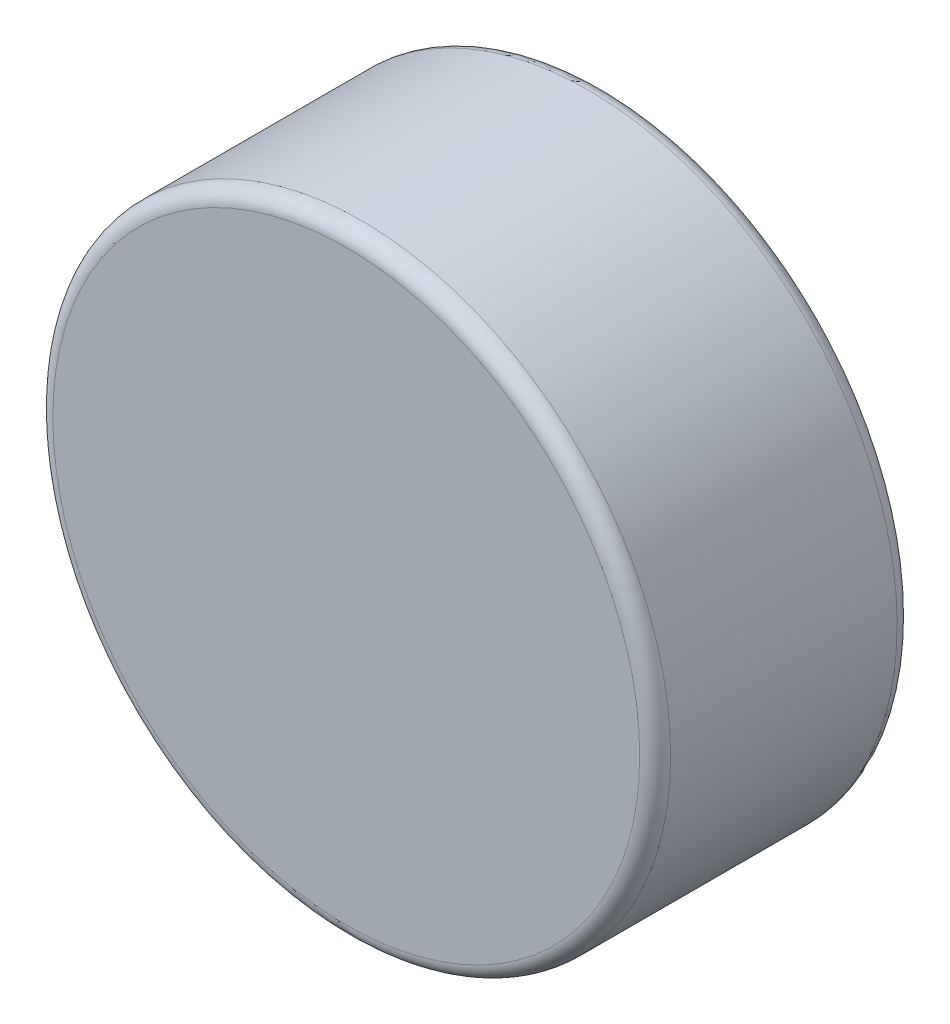
ISO-10303-21;
HEADER;
FILE_DESCRIPTION(('STEP AP214'),'2;1');
FILE_NAME('part.step','',(''),(''),'','','');
FILE_SCHEMA(('AUTOMOTIVE_DESIGN { 1 0 10303 214 1 1 1 1 }'));
ENDSEC;
DATA;
#1=APPLICATION_CONTEXT('core data for automotive mechanical design processes');
#2=APPLICATION_PROTOCOL_DEFINITION('international standard','automotive_design',2000,#1);
#3=PRODUCT_CONTEXT('',#1,'mechanical');
#4=PRODUCT('Part','Part','',(#3));
#5=PRODUCT_RELATED_PRODUCT_CATEGORY('part','',(#4));
#6=PRODUCT_DEFINITION_FORMATION('','',#4);
#7=PRODUCT_DEFINITION_CONTEXT('part definition',#1,'design');
#8=PRODUCT_DEFINITION('design','',#6,#7);
#9=PRODUCT_DEFINITION_SHAPE('','',#8);
#10=(LENGTH_UNIT() NAMED_UNIT(*) SI_UNIT(.MILLI.,.METRE.));
#11=(NAMED_UNIT(*) PLANE_ANGLE_UNIT() SI_UNIT($,.RADIAN.));
#12=(NAMED_UNIT(*) SI_UNIT($,.STERADIAN.) SOLID_ANGLE_UNIT());
#13=UNCERTAINTY_MEASURE_WITH_UNIT(LENGTH_MEASURE(1.E-05),#10,'distance_accuracy_value','');
#14=(GEOMETRIC_REPRESENTATION_CONTEXT(3) GLOBAL_UNCERTAINTY_ASSIGNED_CONTEXT((#13)) GLOBAL_UNIT_ASSIGNED_CONTEXT((#10,
#11,#12)) REPRESENTATION_CONTEXT('',''));
#15=CARTESIAN_POINT('',(0.,0.,0.));
#16=DIRECTION('',(0.,0.,1.));
#17=DIRECTION('',(1.,0.,0.));
#18=AXIS2_PLACEMENT_3D('',#15,#16,#17);
#19=CARTESIAN_POINT('',(0.,0.,2.5));
#20=DIRECTION('',(0.,0.,-1.));
#21=DIRECTION('',(-1.,0.,0.));
#22=AXIS2_PLACEMENT_3D('',#19,#20,#21);
#23=CYLINDRICAL_SURFACE('',#22,3.);
#24=CARTESIAN_POINT('',(0.,0.,0.15));
#25=DIRECTION('',(0.,0.,1.));
#26=DIRECTION('',(1.,0.,0.));
#27=AXIS2_PLACEMENT_3D('',#24,#25,#26);
#28=CIRCLE('',#27,3.);
#29=CARTESIAN_POINT('',(3.,0.,0.15));
#30=VERTEX_POINT('',#29);
#31=EDGE_CURVE('E43',#30,#30,#28,.T.);
#32=ORIENTED_EDGE('',*,*,#31,.T.);
#33=EDGE_LOOP('',(#32));
#34=FACE_BOUND('',#33,.T.);
#35=CARTESIAN_POINT('',(0.,0.,2.35));
#36=DIRECTION('',(0.,0.,1.));
#37=DIRECTION('',(1.,0.,0.));
#38=AXIS2_PLACEMENT_3D('',#35,#36,#37);
#39=CIRCLE('',#38,3.);
#40=CARTESIAN_POINT('',(3.,0.,2.35));
#41=VERTEX_POINT('',#40);
#42=EDGE_CURVE('E47',#41,#41,#39,.F.);
#43=ORIENTED_EDGE('',*,*,#42,.T.);
#44=EDGE_LOOP('',(#43));
#45=FACE_BOUND('',#44,.T.);
#46=ADVANCED_FACE('F32',(#34,#45),#23,.T.);
#47=CARTESIAN_POINT('',(0.,0.,2.5));
#48=DIRECTION('',(0.,0.,1.));
#49=DIRECTION('',(1.,0.,0.));
#50=AXIS2_PLACEMENT_3D('',#47,#48,#49);
#51=PLANE('',#50);
#52=CARTESIAN_POINT('',(0.,0.,2.5));
#53=DIRECTION('',(0.,0.,1.));
#54=DIRECTION('',(1.,0.,0.));
#55=AXIS2_PLACEMENT_3D('',#52,#53,#54);
#56=CIRCLE('',#55,2.85);
#57=CARTESIAN_POINT('',(2.85,0.,2.5));
#58=VERTEX_POINT('',#57);
#59=EDGE_CURVE('E10',#58,#58,#56,.T.);
#60=ORIENTED_EDGE('',*,*,#59,.T.);
#61=EDGE_LOOP('',(#60));
#62=FACE_BOUND('',#61,.T.);
#63=ADVANCED_FACE('F63',(#62),#51,.T.);
#64=CARTESIAN_POINT('',(0.,0.,0.));
#65=DIRECTION('',(0.,0.,1.));
#66=DIRECTION('',(1.,0.,0.));
#67=AXIS2_PLACEMENT_3D('',#64,#65,#66);
#68=PLANE('',#67);
#69=CARTESIAN_POINT('',(0.,0.,0.));
#70=DIRECTION('',(0.,0.,1.));
#71=DIRECTION('',(1.,0.,0.));
#72=AXIS2_PLACEMENT_3D('',#69,#70,#71);
#73=CIRCLE('',#72,2.85);
#74=CARTESIAN_POINT('',(2.85,0.,0.));
#75=VERTEX_POINT('',#74);
#76=EDGE_CURVE('E39',#75,#75,#73,.F.);
#77=ORIENTED_EDGE('',*,*,#76,.T.);
#78=EDGE_LOOP('',(#77));
#79=FACE_BOUND('',#78,.T.);
#80=ADVANCED_FACE('F60',(#79),#68,.F.);
#81=CARTESIAN_POINT('',(0.,0.,0.15));
#82=DIRECTION('',(0.,0.,1.));
#83=DIRECTION('',(1.,0.,0.));
#84=AXIS2_PLACEMENT_3D('',#81,#82,#83);
#85=TOROIDAL_SURFACE('',#84,2.85,0.15);
#86=ORIENTED_EDGE('',*,*,#76,.F.);
#87=EDGE_LOOP('',(#86));
#88=FACE_BOUND('',#87,.T.);
#89=ORIENTED_EDGE('',*,*,#31,.F.);
#90=EDGE_LOOP('',(#89));
#91=FACE_BOUND('',#90,.T.);
#92=ADVANCED_FACE('F56',(#88,#91),#85,.T.);
#93=CARTESIAN_POINT('',(0.,0.,2.35));
#94=DIRECTION('',(0.,0.,1.));
#95=DIRECTION('',(1.,0.,0.));
#96=AXIS2_PLACEMENT_3D('',#93,#94,#95);
#97=TOROIDAL_SURFACE('',#96,2.85,0.15);
#98=ORIENTED_EDGE('',*,*,#42,.F.);
#99=EDGE_LOOP('',(#98));
#100=FACE_BOUND('',#99,.T.);
#101=ORIENTED_EDGE('',*,*,#59,.F.);
#102=EDGE_LOOP('',(#101));
#103=FACE_BOUND('',#102,.T.);
#104=ADVANCED_FACE('F34',(#100,#103),#97,.T.);
#105=CLOSED_SHELL('',(#46,#63,#80,#92,#104));
#106=MANIFOLD_SOLID_BREP('B2',#105);
#107=ADVANCED_BREP_SHAPE_REPRESENTATION('',(#18,#106),#14);
#108=SHAPE_DEFINITION_REPRESENTATION(#9,#107);
ENDSEC;
END-ISO-10303-21;
